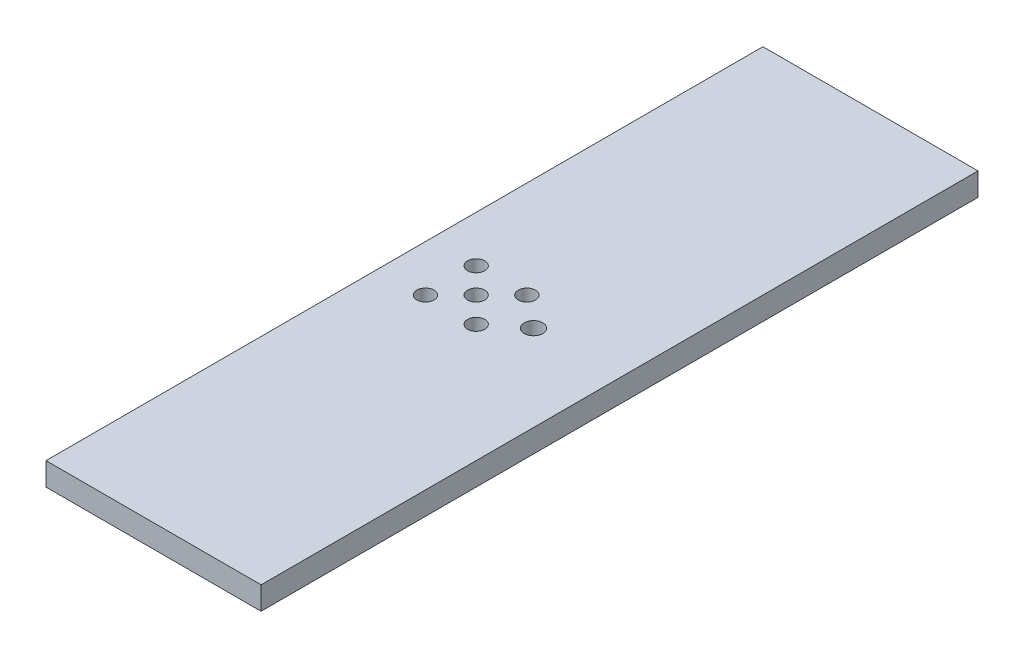
ISO-10303-21;
HEADER;
FILE_DESCRIPTION(('STEP AP214'),'2;1');
FILE_NAME('part.step','',(''),(''),'','','');
FILE_SCHEMA(('AUTOMOTIVE_DESIGN { 1 0 10303 214 1 1 1 1 }'));
ENDSEC;
DATA;
#1=APPLICATION_CONTEXT('core data for automotive mechanical design processes');
#2=APPLICATION_PROTOCOL_DEFINITION('international standard','automotive_design',2000,#1);
#3=PRODUCT_CONTEXT('',#1,'mechanical');
#4=PRODUCT('Part','Part','',(#3));
#5=PRODUCT_RELATED_PRODUCT_CATEGORY('part','',(#4));
#6=PRODUCT_DEFINITION_FORMATION('','',#4);
#7=PRODUCT_DEFINITION_CONTEXT('part definition',#1,'design');
#8=PRODUCT_DEFINITION('design','',#6,#7);
#9=PRODUCT_DEFINITION_SHAPE('','',#8);
#10=(LENGTH_UNIT() NAMED_UNIT(*) SI_UNIT(.MILLI.,.METRE.));
#11=(NAMED_UNIT(*) PLANE_ANGLE_UNIT() SI_UNIT($,.RADIAN.));
#12=(NAMED_UNIT(*) SI_UNIT($,.STERADIAN.) SOLID_ANGLE_UNIT());
#13=UNCERTAINTY_MEASURE_WITH_UNIT(LENGTH_MEASURE(1.E-05),#10,'distance_accuracy_value','');
#14=(GEOMETRIC_REPRESENTATION_CONTEXT(3) GLOBAL_UNCERTAINTY_ASSIGNED_CONTEXT((#13)) GLOBAL_UNIT_ASSIGNED_CONTEXT((#10,
#11,#12)) REPRESENTATION_CONTEXT('',''));
#15=CARTESIAN_POINT('',(0.,0.,0.));
#16=DIRECTION('',(0.,0.,1.));
#17=DIRECTION('',(1.,0.,0.));
#18=AXIS2_PLACEMENT_3D('',#15,#16,#17);
#19=CARTESIAN_POINT('',(15.,1.6,25.));
#20=DIRECTION('',(0.,0.,1.));
#21=DIRECTION('',(1.,0.,0.));
#22=AXIS2_PLACEMENT_3D('',#19,#20,#21);
#23=PLANE('',#22);
#24=DIRECTION('',(-1.,0.,0.));
#25=VECTOR('',#24,1.);
#26=CARTESIAN_POINT('',(15.,0.,25.));
#27=LINE('',#26,#25);
#28=CARTESIAN_POINT('',(15.,0.,25.));
#29=VERTEX_POINT('',#28);
#30=CARTESIAN_POINT('',(0.,0.,25.));
#31=VERTEX_POINT('',#30);
#32=EDGE_CURVE('E98',#29,#31,#27,.T.);
#33=ORIENTED_EDGE('',*,*,#32,.F.);
#34=DIRECTION('',(0.,-1.,0.));
#35=VECTOR('',#34,1.);
#36=CARTESIAN_POINT('',(15.,1.6,25.));
#37=LINE('',#36,#35);
#38=CARTESIAN_POINT('',(15.,1.6,25.));
#39=VERTEX_POINT('',#38);
#40=EDGE_CURVE('E11',#39,#29,#37,.T.);
#41=ORIENTED_EDGE('',*,*,#40,.F.);
#42=DIRECTION('',(-1.,0.,0.));
#43=VECTOR('',#42,1.);
#44=CARTESIAN_POINT('',(15.,1.6,25.));
#45=LINE('',#44,#43);
#46=CARTESIAN_POINT('',(0.,1.6,25.));
#47=VERTEX_POINT('',#46);
#48=EDGE_CURVE('E91',#39,#47,#45,.T.);
#49=ORIENTED_EDGE('',*,*,#48,.T.);
#50=DIRECTION('',(0.,-1.,0.));
#51=VECTOR('',#50,1.);
#52=CARTESIAN_POINT('',(0.,1.6,25.));
#53=LINE('',#52,#51);
#54=EDGE_CURVE('E36',#47,#31,#53,.T.);
#55=ORIENTED_EDGE('',*,*,#54,.T.);
#56=EDGE_LOOP('',(#33,#41,#49,#55));
#57=FACE_BOUND('',#56,.T.);
#58=ADVANCED_FACE('F33',(#57),#23,.T.);
#59=CARTESIAN_POINT('',(15.,1.6,-25.));
#60=DIRECTION('',(1.,0.,0.));
#61=DIRECTION('',(0.,0.,-1.));
#62=AXIS2_PLACEMENT_3D('',#59,#60,#61);
#63=PLANE('',#62);
#64=DIRECTION('',(0.,0.,1.));
#65=VECTOR('',#64,1.);
#66=CARTESIAN_POINT('',(15.,0.,-25.));
#67=LINE('',#66,#65);
#68=CARTESIAN_POINT('',(15.,0.,-25.));
#69=VERTEX_POINT('',#68);
#70=EDGE_CURVE('E93',#69,#29,#67,.T.);
#71=ORIENTED_EDGE('',*,*,#70,.F.);
#72=DIRECTION('',(0.,-1.,0.));
#73=VECTOR('',#72,1.);
#74=CARTESIAN_POINT('',(15.,1.6,-25.));
#75=LINE('',#74,#73);
#76=CARTESIAN_POINT('',(15.,1.6,-25.));
#77=VERTEX_POINT('',#76);
#78=EDGE_CURVE('E42',#77,#69,#75,.T.);
#79=ORIENTED_EDGE('',*,*,#78,.F.);
#80=DIRECTION('',(0.,0.,1.));
#81=VECTOR('',#80,1.);
#82=CARTESIAN_POINT('',(15.,1.6,-25.));
#83=LINE('',#82,#81);
#84=EDGE_CURVE('E88',#77,#39,#83,.T.);
#85=ORIENTED_EDGE('',*,*,#84,.T.);
#86=ORIENTED_EDGE('',*,*,#40,.T.);
#87=EDGE_LOOP('',(#71,#79,#85,#86));
#88=FACE_BOUND('',#87,.T.);
#89=ADVANCED_FACE('F109',(#88),#63,.T.);
#90=CARTESIAN_POINT('',(0.,1.6,-25.));
#91=DIRECTION('',(0.,0.,-1.));
#92=DIRECTION('',(-1.,0.,0.));
#93=AXIS2_PLACEMENT_3D('',#90,#91,#92);
#94=PLANE('',#93);
#95=DIRECTION('',(1.,0.,0.));
#96=VECTOR('',#95,1.);
#97=CARTESIAN_POINT('',(0.,0.,-25.));
#98=LINE('',#97,#96);
#99=CARTESIAN_POINT('',(0.,0.,-25.));
#100=VERTEX_POINT('',#99);
#101=EDGE_CURVE('E83',#100,#69,#98,.T.);
#102=ORIENTED_EDGE('',*,*,#101,.F.);
#103=DIRECTION('',(0.,-1.,0.));
#104=VECTOR('',#103,1.);
#105=CARTESIAN_POINT('',(0.,1.6,-25.));
#106=LINE('',#105,#104);
#107=CARTESIAN_POINT('',(0.,1.6,-25.));
#108=VERTEX_POINT('',#107);
#109=EDGE_CURVE('E78',#108,#100,#106,.T.);
#110=ORIENTED_EDGE('',*,*,#109,.F.);
#111=DIRECTION('',(1.,0.,0.));
#112=VECTOR('',#111,1.);
#113=CARTESIAN_POINT('',(0.,1.6,-25.));
#114=LINE('',#113,#112);
#115=EDGE_CURVE('E81',#108,#77,#114,.T.);
#116=ORIENTED_EDGE('',*,*,#115,.T.);
#117=ORIENTED_EDGE('',*,*,#78,.T.);
#118=EDGE_LOOP('',(#102,#110,#116,#117));
#119=FACE_BOUND('',#118,.T.);
#120=ADVANCED_FACE('F80',(#119),#94,.T.);
#121=CARTESIAN_POINT('',(0.,1.6,25.));
#122=DIRECTION('',(-1.,0.,0.));
#123=DIRECTION('',(0.,0.,1.));
#124=AXIS2_PLACEMENT_3D('',#121,#122,#123);
#125=PLANE('',#124);
#126=DIRECTION('',(0.,0.,-1.));
#127=VECTOR('',#126,1.);
#128=CARTESIAN_POINT('',(0.,0.,25.));
#129=LINE('',#128,#127);
#130=EDGE_CURVE('E101',#31,#100,#129,.T.);
#131=ORIENTED_EDGE('',*,*,#130,.F.);
#132=ORIENTED_EDGE('',*,*,#54,.F.);
#133=DIRECTION('',(0.,0.,-1.));
#134=VECTOR('',#133,1.);
#135=CARTESIAN_POINT('',(0.,1.6,25.));
#136=LINE('',#135,#134);
#137=EDGE_CURVE('E87',#47,#108,#136,.T.);
#138=ORIENTED_EDGE('',*,*,#137,.T.);
#139=ORIENTED_EDGE('',*,*,#109,.T.);
#140=EDGE_LOOP('',(#131,#132,#138,#139));
#141=FACE_BOUND('',#140,.T.);
#142=ADVANCED_FACE('F90',(#141),#125,.T.);
#143=CARTESIAN_POINT('',(0.,1.6,0.));
#144=DIRECTION('',(0.,-1.,0.));
#145=DIRECTION('',(0.,0.,-1.));
#146=AXIS2_PLACEMENT_3D('',#143,#144,#145);
#147=PLANE('',#146);
#148=CARTESIAN_POINT('',(9.,1.6,0.));
#149=DIRECTION('',(0.,1.,0.));
#150=DIRECTION('',(0.,0.,1.));
#151=AXIS2_PLACEMENT_3D('',#148,#149,#150);
#152=CIRCLE('',#151,0.650000000000003);
#153=CARTESIAN_POINT('',(9.,1.6,0.650000000000003));
#154=VERTEX_POINT('',#153);
#155=EDGE_CURVE('E161',#154,#154,#152,.T.);
#156=ORIENTED_EDGE('',*,*,#155,.F.);
#157=EDGE_LOOP('',(#156));
#158=FACE_BOUND('',#157,.T.);
#159=CARTESIAN_POINT('',(3.23223304703363,1.6,1.76776695296637));
#160=DIRECTION('',(0.,1.,0.));
#161=DIRECTION('',(0.,0.,1.));
#162=AXIS2_PLACEMENT_3D('',#159,#160,#161);
#163=CIRCLE('',#162,0.600000000000007);
#164=CARTESIAN_POINT('',(3.23223304703363,1.6,2.36776695296638));
#165=VERTEX_POINT('',#164);
#166=EDGE_CURVE('E165',#165,#165,#163,.T.);
#167=ORIENTED_EDGE('',*,*,#166,.F.);
#168=EDGE_LOOP('',(#167));
#169=FACE_BOUND('',#168,.T.);
#170=CARTESIAN_POINT('',(6.76776695296637,1.6,1.76776695296637));
#171=DIRECTION('',(0.,1.,0.));
#172=DIRECTION('',(0.,0.,1.));
#173=AXIS2_PLACEMENT_3D('',#170,#171,#172);
#174=CIRCLE('',#173,0.600000000000007);
#175=CARTESIAN_POINT('',(6.76776695296637,1.6,2.36776695296638));
#176=VERTEX_POINT('',#175);
#177=EDGE_CURVE('E172',#176,#176,#174,.T.);
#178=ORIENTED_EDGE('',*,*,#177,.F.);
#179=EDGE_LOOP('',(#178));
#180=FACE_BOUND('',#179,.T.);
#181=CARTESIAN_POINT('',(6.76776695296637,1.6,-1.76776695296637));
#182=DIRECTION('',(0.,1.,0.));
#183=DIRECTION('',(0.,0.,1.));
#184=AXIS2_PLACEMENT_3D('',#181,#182,#183);
#185=CIRCLE('',#184,0.600000000000007);
#186=CARTESIAN_POINT('',(6.76776695296637,1.6,-1.16776695296636));
#187=VERTEX_POINT('',#186);
#188=EDGE_CURVE('E178',#187,#187,#185,.T.);
#189=ORIENTED_EDGE('',*,*,#188,.F.);
#190=EDGE_LOOP('',(#189));
#191=FACE_BOUND('',#190,.T.);
#192=CARTESIAN_POINT('',(3.23223304703363,1.6,-1.76776695296637));
#193=DIRECTION('',(0.,1.,0.));
#194=DIRECTION('',(0.,0.,1.));
#195=AXIS2_PLACEMENT_3D('',#192,#193,#194);
#196=CIRCLE('',#195,0.600000000000007);
#197=CARTESIAN_POINT('',(3.23223304703363,1.6,-1.16776695296636));
#198=VERTEX_POINT('',#197);
#199=EDGE_CURVE('E184',#198,#198,#196,.T.);
#200=ORIENTED_EDGE('',*,*,#199,.F.);
#201=EDGE_LOOP('',(#200));
#202=FACE_BOUND('',#201,.T.);
#203=CARTESIAN_POINT('',(5.,1.6,0.));
#204=DIRECTION('',(0.,1.,0.));
#205=DIRECTION('',(0.,0.,1.));
#206=AXIS2_PLACEMENT_3D('',#203,#204,#205);
#207=CIRCLE('',#206,0.600000000000007);
#208=CARTESIAN_POINT('',(5.,1.6,0.600000000000007));
#209=VERTEX_POINT('',#208);
#210=EDGE_CURVE('E102',#209,#209,#207,.T.);
#211=ORIENTED_EDGE('',*,*,#210,.F.);
#212=EDGE_LOOP('',(#211));
#213=FACE_BOUND('',#212,.T.);
#214=ORIENTED_EDGE('',*,*,#48,.F.);
#215=ORIENTED_EDGE('',*,*,#84,.F.);
#216=ORIENTED_EDGE('',*,*,#115,.F.);
#217=ORIENTED_EDGE('',*,*,#137,.F.);
#218=EDGE_LOOP('',(#214,#215,#216,#217));
#219=FACE_BOUND('',#218,.T.);
#220=ADVANCED_FACE('F86',(#158,#169,#180,#191,#202,#213,#219),#147,.F.);
#221=CARTESIAN_POINT('',(0.,0.,0.));
#222=DIRECTION('',(0.,-1.,0.));
#223=DIRECTION('',(0.,0.,-1.));
#224=AXIS2_PLACEMENT_3D('',#221,#222,#223);
#225=PLANE('',#224);
#226=CARTESIAN_POINT('',(9.,0.,0.));
#227=DIRECTION('',(0.,-1.,0.));
#228=DIRECTION('',(0.,0.,-1.));
#229=AXIS2_PLACEMENT_3D('',#226,#227,#228);
#230=CIRCLE('',#229,0.650000000000003);
#231=CARTESIAN_POINT('',(9.,0.,-0.650000000000003));
#232=VERTEX_POINT('',#231);
#233=EDGE_CURVE('E159',#232,#232,#230,.F.);
#234=ORIENTED_EDGE('',*,*,#233,.T.);
#235=EDGE_LOOP('',(#234));
#236=FACE_BOUND('',#235,.T.);
#237=CARTESIAN_POINT('',(3.23223304703363,0.,1.76776695296637));
#238=DIRECTION('',(0.,-1.,0.));
#239=DIRECTION('',(0.,0.,-1.));
#240=AXIS2_PLACEMENT_3D('',#237,#238,#239);
#241=CIRCLE('',#240,0.600000000000007);
#242=CARTESIAN_POINT('',(3.23223304703363,0.,1.16776695296636));
#243=VERTEX_POINT('',#242);
#244=EDGE_CURVE('E162',#243,#243,#241,.F.);
#245=ORIENTED_EDGE('',*,*,#244,.T.);
#246=EDGE_LOOP('',(#245));
#247=FACE_BOUND('',#246,.T.);
#248=CARTESIAN_POINT('',(6.76776695296637,0.,1.76776695296637));
#249=DIRECTION('',(0.,-1.,0.));
#250=DIRECTION('',(0.,0.,-1.));
#251=AXIS2_PLACEMENT_3D('',#248,#249,#250);
#252=CIRCLE('',#251,0.600000000000007);
#253=CARTESIAN_POINT('',(6.76776695296637,0.,1.16776695296636));
#254=VERTEX_POINT('',#253);
#255=EDGE_CURVE('E170',#254,#254,#252,.F.);
#256=ORIENTED_EDGE('',*,*,#255,.T.);
#257=EDGE_LOOP('',(#256));
#258=FACE_BOUND('',#257,.T.);
#259=CARTESIAN_POINT('',(6.76776695296637,0.,-1.76776695296637));
#260=DIRECTION('',(0.,-1.,0.));
#261=DIRECTION('',(0.,0.,-1.));
#262=AXIS2_PLACEMENT_3D('',#259,#260,#261);
#263=CIRCLE('',#262,0.600000000000007);
#264=CARTESIAN_POINT('',(6.76776695296637,0.,-2.36776695296638));
#265=VERTEX_POINT('',#264);
#266=EDGE_CURVE('E175',#265,#265,#263,.F.);
#267=ORIENTED_EDGE('',*,*,#266,.T.);
#268=EDGE_LOOP('',(#267));
#269=FACE_BOUND('',#268,.T.);
#270=CARTESIAN_POINT('',(3.23223304703363,0.,-1.76776695296637));
#271=DIRECTION('',(0.,-1.,0.));
#272=DIRECTION('',(0.,0.,-1.));
#273=AXIS2_PLACEMENT_3D('',#270,#271,#272);
#274=CIRCLE('',#273,0.600000000000007);
#275=CARTESIAN_POINT('',(3.23223304703363,0.,-2.36776695296638));
#276=VERTEX_POINT('',#275);
#277=EDGE_CURVE('E181',#276,#276,#274,.F.);
#278=ORIENTED_EDGE('',*,*,#277,.T.);
#279=EDGE_LOOP('',(#278));
#280=FACE_BOUND('',#279,.T.);
#281=CARTESIAN_POINT('',(5.,0.,0.));
#282=DIRECTION('',(0.,-1.,0.));
#283=DIRECTION('',(0.,0.,-1.));
#284=AXIS2_PLACEMENT_3D('',#281,#282,#283);
#285=CIRCLE('',#284,0.600000000000007);
#286=CARTESIAN_POINT('',(5.,0.,-0.600000000000007));
#287=VERTEX_POINT('',#286);
#288=EDGE_CURVE('E187',#287,#287,#285,.F.);
#289=ORIENTED_EDGE('',*,*,#288,.T.);
#290=EDGE_LOOP('',(#289));
#291=FACE_BOUND('',#290,.T.);
#292=ORIENTED_EDGE('',*,*,#32,.T.);
#293=ORIENTED_EDGE('',*,*,#130,.T.);
#294=ORIENTED_EDGE('',*,*,#101,.T.);
#295=ORIENTED_EDGE('',*,*,#70,.T.);
#296=EDGE_LOOP('',(#292,#293,#294,#295));
#297=FACE_BOUND('',#296,.T.);
#298=ADVANCED_FACE('F108',(#236,#247,#258,#269,#280,#291,#297),#225,.T.);
#299=CARTESIAN_POINT('',(5.,-0.000999999999999916,0.));
#300=DIRECTION('',(0.,1.,0.));
#301=DIRECTION('',(0.,0.,1.));
#302=AXIS2_PLACEMENT_3D('',#299,#300,#301);
#303=CYLINDRICAL_SURFACE('',#302,0.600000000000007);
#304=ORIENTED_EDGE('',*,*,#288,.F.);
#305=EDGE_LOOP('',(#304));
#306=FACE_BOUND('',#305,.T.);
#307=ORIENTED_EDGE('',*,*,#210,.T.);
#308=EDGE_LOOP('',(#307));
#309=FACE_BOUND('',#308,.T.);
#310=ADVANCED_FACE('F127',(#306,#309),#303,.F.);
#311=CARTESIAN_POINT('',(3.23223304703363,-0.000999999999999916,-1.76776695296637));
#312=DIRECTION('',(0.,1.,0.));
#313=DIRECTION('',(0.,0.,1.));
#314=AXIS2_PLACEMENT_3D('',#311,#312,#313);
#315=CYLINDRICAL_SURFACE('',#314,0.600000000000007);
#316=ORIENTED_EDGE('',*,*,#277,.F.);
#317=EDGE_LOOP('',(#316));
#318=FACE_BOUND('',#317,.T.);
#319=ORIENTED_EDGE('',*,*,#199,.T.);
#320=EDGE_LOOP('',(#319));
#321=FACE_BOUND('',#320,.T.);
#322=ADVANCED_FACE('F134',(#318,#321),#315,.F.);
#323=CARTESIAN_POINT('',(6.76776695296637,-0.000999999999999916,-1.76776695296637));
#324=DIRECTION('',(0.,1.,0.));
#325=DIRECTION('',(0.,0.,1.));
#326=AXIS2_PLACEMENT_3D('',#323,#324,#325);
#327=CYLINDRICAL_SURFACE('',#326,0.600000000000007);
#328=ORIENTED_EDGE('',*,*,#266,.F.);
#329=EDGE_LOOP('',(#328));
#330=FACE_BOUND('',#329,.T.);
#331=ORIENTED_EDGE('',*,*,#188,.T.);
#332=EDGE_LOOP('',(#331));
#333=FACE_BOUND('',#332,.T.);
#334=ADVANCED_FACE('F138',(#330,#333),#327,.F.);
#335=CARTESIAN_POINT('',(6.76776695296637,-0.000999999999999916,1.76776695296637));
#336=DIRECTION('',(0.,1.,0.));
#337=DIRECTION('',(0.,0.,1.));
#338=AXIS2_PLACEMENT_3D('',#335,#336,#337);
#339=CYLINDRICAL_SURFACE('',#338,0.600000000000007);
#340=ORIENTED_EDGE('',*,*,#255,.F.);
#341=EDGE_LOOP('',(#340));
#342=FACE_BOUND('',#341,.T.);
#343=ORIENTED_EDGE('',*,*,#177,.T.);
#344=EDGE_LOOP('',(#343));
#345=FACE_BOUND('',#344,.T.);
#346=ADVANCED_FACE('F142',(#342,#345),#339,.F.);
#347=CARTESIAN_POINT('',(3.23223304703363,-0.000999999999999916,1.76776695296637));
#348=DIRECTION('',(0.,1.,0.));
#349=DIRECTION('',(0.,0.,1.));
#350=AXIS2_PLACEMENT_3D('',#347,#348,#349);
#351=CYLINDRICAL_SURFACE('',#350,0.600000000000007);
#352=ORIENTED_EDGE('',*,*,#244,.F.);
#353=EDGE_LOOP('',(#352));
#354=FACE_BOUND('',#353,.T.);
#355=ORIENTED_EDGE('',*,*,#166,.T.);
#356=EDGE_LOOP('',(#355));
#357=FACE_BOUND('',#356,.T.);
#358=ADVANCED_FACE('F146',(#354,#357),#351,.F.);
#359=CARTESIAN_POINT('',(9.,-0.000999999999999916,0.));
#360=DIRECTION('',(0.,1.,0.));
#361=DIRECTION('',(0.,0.,1.));
#362=AXIS2_PLACEMENT_3D('',#359,#360,#361);
#363=CYLINDRICAL_SURFACE('',#362,0.650000000000003);
#364=ORIENTED_EDGE('',*,*,#233,.F.);
#365=EDGE_LOOP('',(#364));
#366=FACE_BOUND('',#365,.T.);
#367=ORIENTED_EDGE('',*,*,#155,.T.);
#368=EDGE_LOOP('',(#367));
#369=FACE_BOUND('',#368,.T.);
#370=ADVANCED_FACE('F150',(#366,#369),#363,.F.);
#371=CLOSED_SHELL('',(#58,#89,#120,#142,#220,#298,#310,#322,#334,#346,#358,#370));
#372=MANIFOLD_SOLID_BREP('B2',#371);
#373=ADVANCED_BREP_SHAPE_REPRESENTATION('',(#18,#372),#14);
#374=SHAPE_DEFINITION_REPRESENTATION(#9,#373);
ENDSEC;
END-ISO-10303-21;
